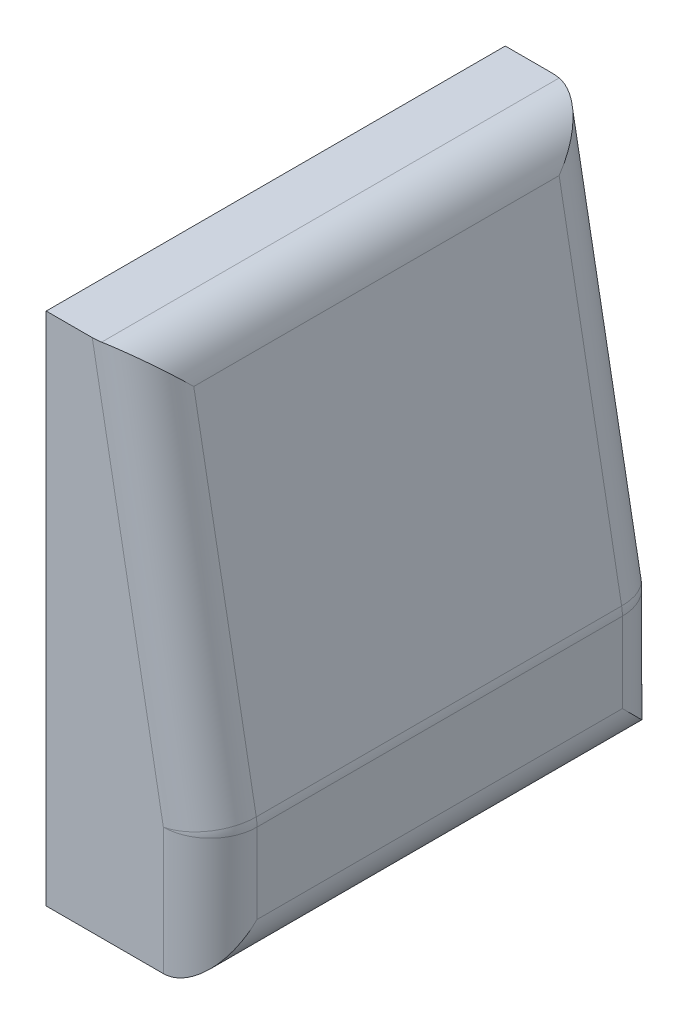
ISO-10303-21;
HEADER;
FILE_DESCRIPTION(('STEP AP214'),'2;1');
FILE_NAME('part.step','',(''),(''),'','','');
FILE_SCHEMA(('AUTOMOTIVE_DESIGN { 1 0 10303 214 1 1 1 1 }'));
ENDSEC;
DATA;
#1=APPLICATION_CONTEXT('core data for automotive mechanical design processes');
#2=APPLICATION_PROTOCOL_DEFINITION('international standard','automotive_design',2000,#1);
#3=PRODUCT_CONTEXT('',#1,'mechanical');
#4=PRODUCT('Part','Part','',(#3));
#5=PRODUCT_RELATED_PRODUCT_CATEGORY('part','',(#4));
#6=PRODUCT_DEFINITION_FORMATION('','',#4);
#7=PRODUCT_DEFINITION_CONTEXT('part definition',#1,'design');
#8=PRODUCT_DEFINITION('design','',#6,#7);
#9=PRODUCT_DEFINITION_SHAPE('','',#8);
#10=(LENGTH_UNIT() NAMED_UNIT(*) SI_UNIT(.MILLI.,.METRE.));
#11=(NAMED_UNIT(*) PLANE_ANGLE_UNIT() SI_UNIT($,.RADIAN.));
#12=(NAMED_UNIT(*) SI_UNIT($,.STERADIAN.) SOLID_ANGLE_UNIT());
#13=UNCERTAINTY_MEASURE_WITH_UNIT(LENGTH_MEASURE(1.E-05),#10,'distance_accuracy_value','');
#14=(GEOMETRIC_REPRESENTATION_CONTEXT(3) GLOBAL_UNCERTAINTY_ASSIGNED_CONTEXT((#13)) GLOBAL_UNIT_ASSIGNED_CONTEXT((#10,
#11,#12)) REPRESENTATION_CONTEXT('',''));
#15=CARTESIAN_POINT('',(0.,0.,0.));
#16=DIRECTION('',(0.,0.,1.));
#17=DIRECTION('',(1.,0.,0.));
#18=AXIS2_PLACEMENT_3D('',#15,#16,#17);
#19=CARTESIAN_POINT('',(200.,550.,490.));
#20=DIRECTION('',(0.,-1.,0.));
#21=DIRECTION('',(1.,0.,0.));
#22=AXIS2_PLACEMENT_3D('',#19,#20,#21);
#23=PLANE('',#22);
#24=DIRECTION('',(-1.,0.,0.));
#25=VECTOR('',#24,1.);
#26=CARTESIAN_POINT('',(200.,550.,490.));
#27=LINE('',#26,#25);
#28=CARTESIAN_POINT('',(98.3406558713782,550.,490.));
#29=VERTEX_POINT('',#28);
#30=CARTESIAN_POINT('',(-2.05721908245201E-13,550.,490.));
#31=VERTEX_POINT('',#30);
#32=EDGE_CURVE('E120',#29,#31,#27,.T.);
#33=ORIENTED_EDGE('',*,*,#32,.F.);
#34=CARTESIAN_POINT('',(98.3406558713782,550.,390.));
#35=DIRECTION('',(0.,-1.,0.));
#36=DIRECTION('',(1.,0.,0.));
#37=AXIS2_PLACEMENT_3D('',#34,#35,#36);
#38=ELLIPSE('',#37,101.659344128622,100.);
#39=CARTESIAN_POINT('',(116.633338798207,550.,488.367740670723));
#40=VERTEX_POINT('',#39);
#41=EDGE_CURVE('E155',#29,#40,#38,.F.);
#42=ORIENTED_EDGE('',*,*,#41,.T.);
#43=DIRECTION('',(0.,0.,-1.));
#44=VECTOR('',#43,1.);
#45=CARTESIAN_POINT('',(116.633338798207,550.,490.));
#46=LINE('',#45,#44);
#47=CARTESIAN_POINT('',(116.633338798207,550.,-488.367740670723));
#48=VERTEX_POINT('',#47);
#49=EDGE_CURVE('E153',#40,#48,#46,.T.);
#50=ORIENTED_EDGE('',*,*,#49,.T.);
#51=CARTESIAN_POINT('',(98.3406558713782,550.,-390.));
#52=DIRECTION('',(0.,-1.,0.));
#53=DIRECTION('',(-1.,0.,0.));
#54=AXIS2_PLACEMENT_3D('',#51,#52,#53);
#55=ELLIPSE('',#54,101.659344128622,100.);
#56=CARTESIAN_POINT('',(98.3406558713782,550.,-490.));
#57=VERTEX_POINT('',#56);
#58=EDGE_CURVE('E151',#48,#57,#55,.F.);
#59=ORIENTED_EDGE('',*,*,#58,.T.);
#60=DIRECTION('',(-1.,0.,0.));
#61=VECTOR('',#60,1.);
#62=CARTESIAN_POINT('',(200.,550.,-490.));
#63=LINE('',#62,#61);
#64=CARTESIAN_POINT('',(-2.05721908245201E-13,550.,-490.));
#65=VERTEX_POINT('',#64);
#66=EDGE_CURVE('E142',#57,#65,#63,.T.);
#67=ORIENTED_EDGE('',*,*,#66,.T.);
#68=DIRECTION('',(0.,0.,-1.));
#69=VECTOR('',#68,1.);
#70=CARTESIAN_POINT('',(-2.05721908245201E-13,550.,490.));
#71=LINE('',#70,#69);
#72=EDGE_CURVE('E135',#31,#65,#71,.T.);
#73=ORIENTED_EDGE('',*,*,#72,.F.);
#74=EDGE_LOOP('',(#33,#42,#50,#59,#67,#73));
#75=FACE_BOUND('',#74,.T.);
#76=ADVANCED_FACE('F43',(#75),#23,.F.);
#77=CARTESIAN_POINT('',(-2.05721908245201E-13,550.,490.));
#78=DIRECTION('',(1.,0.,0.));
#79=DIRECTION('',(0.,1.,0.));
#80=AXIS2_PLACEMENT_3D('',#77,#78,#79);
#81=PLANE('',#80);
#82=DIRECTION('',(0.,-1.,0.));
#83=VECTOR('',#82,1.);
#84=CARTESIAN_POINT('',(-2.05721908245201E-13,550.,-490.));
#85=LINE('',#84,#83);
#86=CARTESIAN_POINT('',(1.31055961520322E-13,-550.,-490.));
#87=VERTEX_POINT('',#86);
#88=EDGE_CURVE('E207',#65,#87,#85,.T.);
#89=ORIENTED_EDGE('',*,*,#88,.T.);
#90=DIRECTION('',(0.,0.,-1.));
#91=VECTOR('',#90,1.);
#92=CARTESIAN_POINT('',(1.31055961520322E-13,-550.,490.));
#93=LINE('',#92,#91);
#94=CARTESIAN_POINT('',(1.31055961520322E-13,-550.,490.));
#95=VERTEX_POINT('',#94);
#96=EDGE_CURVE('E137',#95,#87,#93,.T.);
#97=ORIENTED_EDGE('',*,*,#96,.F.);
#98=DIRECTION('',(0.,-1.,0.));
#99=VECTOR('',#98,1.);
#100=CARTESIAN_POINT('',(-2.05721908245201E-13,550.,490.));
#101=LINE('',#100,#99);
#102=EDGE_CURVE('E124',#31,#95,#101,.T.);
#103=ORIENTED_EDGE('',*,*,#102,.F.);
#104=ORIENTED_EDGE('',*,*,#72,.T.);
#105=EDGE_LOOP('',(#89,#97,#103,#104));
#106=FACE_BOUND('',#105,.T.);
#107=ADVANCED_FACE('F134',(#106),#81,.F.);
#108=CARTESIAN_POINT('',(1.31055961520322E-13,-550.,490.));
#109=DIRECTION('',(0.,1.,0.));
#110=DIRECTION('',(0.,0.,1.));
#111=AXIS2_PLACEMENT_3D('',#108,#109,#110);
#112=PLANE('',#111);
#113=DIRECTION('',(1.,0.,0.));
#114=VECTOR('',#113,1.);
#115=CARTESIAN_POINT('',(1.31055961520322E-13,-550.,-490.));
#116=LINE('',#115,#114);
#117=CARTESIAN_POINT('',(250.,-550.,-490.));
#118=VERTEX_POINT('',#117);
#119=EDGE_CURVE('E130',#87,#118,#116,.T.);
#120=ORIENTED_EDGE('',*,*,#119,.T.);
#121=DIRECTION('',(0.,0.,-1.));
#122=VECTOR('',#121,1.);
#123=CARTESIAN_POINT('',(250.,-550.,490.));
#124=LINE('',#123,#122);
#125=CARTESIAN_POINT('',(250.,-550.,490.));
#126=VERTEX_POINT('',#125);
#127=EDGE_CURVE('E11',#118,#126,#124,.F.);
#128=ORIENTED_EDGE('',*,*,#127,.T.);
#129=DIRECTION('',(1.,0.,0.));
#130=VECTOR('',#129,1.);
#131=CARTESIAN_POINT('',(1.31055961520322E-13,-550.,490.));
#132=LINE('',#131,#130);
#133=EDGE_CURVE('E139',#95,#126,#132,.T.);
#134=ORIENTED_EDGE('',*,*,#133,.F.);
#135=ORIENTED_EDGE('',*,*,#96,.T.);
#136=EDGE_LOOP('',(#120,#128,#134,#135));
#137=FACE_BOUND('',#136,.T.);
#138=ADVANCED_FACE('F214',(#137),#112,.F.);
#139=CARTESIAN_POINT('',(350.,-550.,490.));
#140=DIRECTION('',(-1.,0.,0.));
#141=DIRECTION('',(0.,0.,1.));
#142=AXIS2_PLACEMENT_3D('',#139,#140,#141);
#143=PLANE('',#142);
#144=DIRECTION('',(0.,1.,0.));
#145=VECTOR('',#144,1.);
#146=CARTESIAN_POINT('',(350.,-550.,390.));
#147=LINE('',#146,#145);
#148=CARTESIAN_POINT('',(350.,-279.071081236465,390.));
#149=VERTEX_POINT('',#148);
#150=CARTESIAN_POINT('',(350.,-450.,390.));
#151=VERTEX_POINT('',#150);
#152=EDGE_CURVE('E60',#149,#151,#147,.F.);
#153=ORIENTED_EDGE('',*,*,#152,.T.);
#154=DIRECTION('',(0.,0.,-1.));
#155=VECTOR('',#154,1.);
#156=CARTESIAN_POINT('',(350.,-450.,490.));
#157=LINE('',#156,#155);
#158=CARTESIAN_POINT('',(350.,-450.,-390.));
#159=VERTEX_POINT('',#158);
#160=EDGE_CURVE('E52',#151,#159,#157,.T.);
#161=ORIENTED_EDGE('',*,*,#160,.T.);
#162=DIRECTION('',(0.,1.,0.));
#163=VECTOR('',#162,1.);
#164=CARTESIAN_POINT('',(350.,-550.,-390.));
#165=LINE('',#164,#163);
#166=CARTESIAN_POINT('',(350.,-279.071081236465,-390.));
#167=VERTEX_POINT('',#166);
#168=EDGE_CURVE('E170',#159,#167,#165,.T.);
#169=ORIENTED_EDGE('',*,*,#168,.T.);
#170=DIRECTION('',(0.,0.,-1.));
#171=VECTOR('',#170,1.);
#172=CARTESIAN_POINT('',(350.,-279.071081236465,490.));
#173=LINE('',#172,#171);
#174=EDGE_CURVE('E65',#167,#149,#173,.F.);
#175=ORIENTED_EDGE('',*,*,#174,.T.);
#176=EDGE_LOOP('',(#153,#161,#169,#175));
#177=FACE_BOUND('',#176,.T.);
#178=ADVANCED_FACE('F380',(#177),#143,.F.);
#179=CARTESIAN_POINT('',(350.,-270.,490.));
#180=DIRECTION('',(-0.983677406707226,-0.17994098903181,0.));
#181=DIRECTION('',(0.17994098903181,-0.983677406707226,0.));
#182=AXIS2_PLACEMENT_3D('',#179,#180,#181);
#183=PLANE('',#182);
#184=DIRECTION('',(0.,0.,-1.));
#185=VECTOR('',#184,1.);
#186=CARTESIAN_POINT('',(215.00107946893,467.994098903181,490.));
#187=LINE('',#186,#185);
#188=CARTESIAN_POINT('',(215.00107946893,467.994098903181,-390.));
#189=VERTEX_POINT('',#188);
#190=CARTESIAN_POINT('',(215.00107946893,467.994098903181,390.));
#191=VERTEX_POINT('',#190);
#192=EDGE_CURVE('E161',#189,#191,#187,.F.);
#193=ORIENTED_EDGE('',*,*,#192,.T.);
#194=DIRECTION('',(-0.17994098903181,0.983677406707226,0.));
#195=VECTOR('',#194,1.);
#196=CARTESIAN_POINT('',(350.,-270.,390.));
#197=LINE('',#196,#195);
#198=CARTESIAN_POINT('',(348.367740670723,-261.076982333284,390.));
#199=VERTEX_POINT('',#198);
#200=EDGE_CURVE('E163',#191,#199,#197,.F.);
#201=ORIENTED_EDGE('',*,*,#200,.T.);
#202=DIRECTION('',(0.,0.,-1.));
#203=VECTOR('',#202,1.);
#204=CARTESIAN_POINT('',(348.367740670723,-261.076982333284,490.));
#205=LINE('',#204,#203);
#206=CARTESIAN_POINT('',(348.367740670723,-261.076982333284,-390.));
#207=VERTEX_POINT('',#206);
#208=EDGE_CURVE('E157',#199,#207,#205,.T.);
#209=ORIENTED_EDGE('',*,*,#208,.T.);
#210=DIRECTION('',(-0.17994098903181,0.983677406707226,0.));
#211=VECTOR('',#210,1.);
#212=CARTESIAN_POINT('',(350.,-270.,-390.));
#213=LINE('',#212,#211);
#214=EDGE_CURVE('E159',#207,#189,#213,.T.);
#215=ORIENTED_EDGE('',*,*,#214,.T.);
#216=EDGE_LOOP('',(#193,#201,#209,#215));
#217=FACE_BOUND('',#216,.T.);
#218=ADVANCED_FACE('F250',(#217),#183,.F.);
#219=CARTESIAN_POINT('',(0.,0.,490.));
#220=DIRECTION('',(0.,0.,1.));
#221=DIRECTION('',(1.,0.,0.));
#222=AXIS2_PLACEMENT_3D('',#219,#220,#221);
#223=PLANE('',#222);
#224=DIRECTION('',(0.,1.,0.));
#225=VECTOR('',#224,1.);
#226=CARTESIAN_POINT('',(250.,-270.,490.));
#227=LINE('',#226,#225);
#228=CARTESIAN_POINT('',(250.,-279.071081236465,490.));
#229=VERTEX_POINT('',#228);
#230=EDGE_CURVE('E144',#126,#229,#227,.T.);
#231=ORIENTED_EDGE('',*,*,#230,.T.);
#232=DIRECTION('',(-0.17994098903181,0.983677406707226,0.));
#233=VECTOR('',#232,1.);
#234=CARTESIAN_POINT('',(101.632259329277,532.005901096819,490.));
#235=LINE('',#234,#233);
#236=EDGE_CURVE('E127',#229,#29,#235,.T.);
#237=ORIENTED_EDGE('',*,*,#236,.T.);
#238=ORIENTED_EDGE('',*,*,#32,.T.);
#239=ORIENTED_EDGE('',*,*,#102,.T.);
#240=ORIENTED_EDGE('',*,*,#133,.T.);
#241=EDGE_LOOP('',(#231,#237,#238,#239,#240));
#242=FACE_BOUND('',#241,.T.);
#243=ADVANCED_FACE('F122',(#242),#223,.T.);
#244=CARTESIAN_POINT('',(0.,0.,-490.));
#245=DIRECTION('',(0.,0.,1.));
#246=DIRECTION('',(1.,0.,0.));
#247=AXIS2_PLACEMENT_3D('',#244,#245,#246);
#248=PLANE('',#247);
#249=ORIENTED_EDGE('',*,*,#66,.F.);
#250=DIRECTION('',(-0.17994098903181,0.983677406707226,0.));
#251=VECTOR('',#250,1.);
#252=CARTESIAN_POINT('',(192.508644420657,35.2149959306081,-490.));
#253=LINE('',#252,#251);
#254=CARTESIAN_POINT('',(250.,-279.071081236465,-490.));
#255=VERTEX_POINT('',#254);
#256=EDGE_CURVE('E168',#57,#255,#253,.F.);
#257=ORIENTED_EDGE('',*,*,#256,.T.);
#258=DIRECTION('',(0.,1.,0.));
#259=VECTOR('',#258,1.);
#260=CARTESIAN_POINT('',(250.,0.,-490.));
#261=LINE('',#260,#259);
#262=EDGE_CURVE('E166',#255,#118,#261,.F.);
#263=ORIENTED_EDGE('',*,*,#262,.T.);
#264=ORIENTED_EDGE('',*,*,#119,.F.);
#265=ORIENTED_EDGE('',*,*,#88,.F.);
#266=EDGE_LOOP('',(#249,#257,#263,#264,#265));
#267=FACE_BOUND('',#266,.T.);
#268=ADVANCED_FACE('F243',(#267),#248,.F.);
#269=CARTESIAN_POINT('',(250.,-550.,-390.));
#270=DIRECTION('',(0.,1.,0.));
#271=DIRECTION('',(0.,0.,1.));
#272=AXIS2_PLACEMENT_3D('',#269,#270,#271);
#273=CYLINDRICAL_SURFACE('',#272,100.);
#274=CARTESIAN_POINT('',(250.,-279.071081236465,-390.));
#275=DIRECTION('',(0.,1.,0.));
#276=DIRECTION('',(0.,0.,1.));
#277=AXIS2_PLACEMENT_3D('',#274,#275,#276);
#278=CIRCLE('',#277,100.);
#279=EDGE_CURVE('E197',#167,#255,#278,.T.);
#280=ORIENTED_EDGE('',*,*,#279,.F.);
#281=ORIENTED_EDGE('',*,*,#168,.F.);
#282=CARTESIAN_POINT('',(250.,-450.,-390.));
#283=DIRECTION('',(0.,0.707106781186547,-0.707106781186547));
#284=DIRECTION('',(0.,0.707106781186547,0.707106781186547));
#285=AXIS2_PLACEMENT_3D('',#282,#283,#284);
#286=ELLIPSE('',#285,141.42135623731,100.);
#287=EDGE_CURVE('E47',#118,#159,#286,.F.);
#288=ORIENTED_EDGE('',*,*,#287,.F.);
#289=ORIENTED_EDGE('',*,*,#262,.F.);
#290=EDGE_LOOP('',(#280,#281,#288,#289));
#291=FACE_BOUND('',#290,.T.);
#292=ADVANCED_FACE('F45',(#291),#273,.T.);
#293=CARTESIAN_POINT('',(250.,-450.,490.));
#294=DIRECTION('',(0.,0.,-1.));
#295=DIRECTION('',(-1.,0.,0.));
#296=AXIS2_PLACEMENT_3D('',#293,#294,#295);
#297=CYLINDRICAL_SURFACE('',#296,100.);
#298=ORIENTED_EDGE('',*,*,#287,.T.);
#299=ORIENTED_EDGE('',*,*,#160,.F.);
#300=CARTESIAN_POINT('',(250.,-450.,390.));
#301=DIRECTION('',(0.,-0.707106781186547,-0.707106781186547));
#302=DIRECTION('',(0.,-0.707106781186547,0.707106781186547));
#303=AXIS2_PLACEMENT_3D('',#300,#301,#302);
#304=ELLIPSE('',#303,141.42135623731,100.);
#305=EDGE_CURVE('E192',#126,#151,#304,.F.);
#306=ORIENTED_EDGE('',*,*,#305,.F.);
#307=ORIENTED_EDGE('',*,*,#127,.F.);
#308=EDGE_LOOP('',(#298,#299,#306,#307));
#309=FACE_BOUND('',#308,.T.);
#310=ADVANCED_FACE('F219',(#309),#297,.T.);
#311=CARTESIAN_POINT('',(250.,-279.071081236465,-390.));
#312=DIRECTION('',(0.,0.,-1.));
#313=DIRECTION('',(-1.,0.,0.));
#314=AXIS2_PLACEMENT_3D('',#311,#312,#313);
#315=SPHERICAL_SURFACE('',#314,100.);
#316=CARTESIAN_POINT('',(250.,-279.071081236465,-390.));
#317=DIRECTION('',(0.17994098903181,-0.983677406707226,0.));
#318=DIRECTION('',(0.983677406707227,0.17994098903181,0.));
#319=AXIS2_PLACEMENT_3D('',#316,#317,#318);
#320=CIRCLE('',#319,100.);
#321=EDGE_CURVE('E189',#207,#255,#320,.F.);
#322=ORIENTED_EDGE('',*,*,#321,.F.);
#323=CARTESIAN_POINT('',(250.,-279.071081236465,-390.));
#324=DIRECTION('',(0.,0.,-1.));
#325=DIRECTION('',(-1.,0.,0.));
#326=AXIS2_PLACEMENT_3D('',#323,#324,#325);
#327=CIRCLE('',#326,100.);
#328=EDGE_CURVE('E195',#167,#207,#327,.F.);
#329=ORIENTED_EDGE('',*,*,#328,.F.);
#330=ORIENTED_EDGE('',*,*,#279,.T.);
#331=EDGE_LOOP('',(#322,#329,#330));
#332=FACE_BOUND('',#331,.T.);
#333=ADVANCED_FACE('F274',(#332),#315,.T.);
#334=CARTESIAN_POINT('',(250.,-279.071081236465,490.));
#335=DIRECTION('',(0.,0.,-1.));
#336=DIRECTION('',(-1.,0.,0.));
#337=AXIS2_PLACEMENT_3D('',#334,#335,#336);
#338=CYLINDRICAL_SURFACE('',#337,100.);
#339=ORIENTED_EDGE('',*,*,#328,.T.);
#340=ORIENTED_EDGE('',*,*,#208,.F.);
#341=CARTESIAN_POINT('',(250.,-279.071081236465,390.));
#342=DIRECTION('',(0.,0.,1.));
#343=DIRECTION('',(1.,0.,0.));
#344=AXIS2_PLACEMENT_3D('',#341,#342,#343);
#345=CIRCLE('',#344,100.);
#346=EDGE_CURVE('E186',#149,#199,#345,.T.);
#347=ORIENTED_EDGE('',*,*,#346,.F.);
#348=ORIENTED_EDGE('',*,*,#174,.F.);
#349=EDGE_LOOP('',(#339,#340,#347,#348));
#350=FACE_BOUND('',#349,.T.);
#351=ADVANCED_FACE('F271',(#350),#338,.T.);
#352=CARTESIAN_POINT('',(250.,0.,390.));
#353=DIRECTION('',(0.,-1.,0.));
#354=DIRECTION('',(0.,0.,-1.));
#355=AXIS2_PLACEMENT_3D('',#352,#353,#354);
#356=CYLINDRICAL_SURFACE('',#355,100.);
#357=ORIENTED_EDGE('',*,*,#305,.T.);
#358=ORIENTED_EDGE('',*,*,#152,.F.);
#359=CARTESIAN_POINT('',(250.,-279.071081236465,390.));
#360=DIRECTION('',(0.,1.,0.));
#361=DIRECTION('',(-1.,0.,0.));
#362=AXIS2_PLACEMENT_3D('',#359,#360,#361);
#363=CIRCLE('',#362,100.);
#364=EDGE_CURVE('E183',#229,#149,#363,.T.);
#365=ORIENTED_EDGE('',*,*,#364,.F.);
#366=ORIENTED_EDGE('',*,*,#230,.F.);
#367=EDGE_LOOP('',(#357,#358,#365,#366));
#368=FACE_BOUND('',#367,.T.);
#369=ADVANCED_FACE('F223',(#368),#356,.T.);
#370=CARTESIAN_POINT('',(251.632259329277,-287.994098903181,-390.));
#371=DIRECTION('',(-0.17994098903181,0.983677406707226,0.));
#372=DIRECTION('',(-0.983677406707226,-0.17994098903181,0.));
#373=AXIS2_PLACEMENT_3D('',#370,#371,#372);
#374=CYLINDRICAL_SURFACE('',#373,100.);
#375=ORIENTED_EDGE('',*,*,#256,.F.);
#376=ORIENTED_EDGE('',*,*,#58,.F.);
#377=CARTESIAN_POINT('',(116.633338798208,450.,-390.));
#378=DIRECTION('',(-0.127237493557807,0.695564964782677,0.707106781186547));
#379=DIRECTION('',(-0.127237493557807,0.695564964782677,-0.707106781186547));
#380=AXIS2_PLACEMENT_3D('',#377,#378,#379);
#381=ELLIPSE('',#380,141.42135623731,100.);
#382=EDGE_CURVE('E180',#189,#48,#381,.T.);
#383=ORIENTED_EDGE('',*,*,#382,.F.);
#384=ORIENTED_EDGE('',*,*,#214,.F.);
#385=ORIENTED_EDGE('',*,*,#321,.T.);
#386=EDGE_LOOP('',(#375,#376,#383,#384,#385));
#387=FACE_BOUND('',#386,.T.);
#388=ADVANCED_FACE('F242',(#387),#374,.T.);
#389=CARTESIAN_POINT('',(250.,-279.071081236465,390.));
#390=DIRECTION('',(0.,0.,1.));
#391=DIRECTION('',(0.,-1.,0.));
#392=AXIS2_PLACEMENT_3D('',#389,#390,#391);
#393=SPHERICAL_SURFACE('',#392,100.);
#394=ORIENTED_EDGE('',*,*,#364,.T.);
#395=ORIENTED_EDGE('',*,*,#346,.T.);
#396=CARTESIAN_POINT('',(250.,-279.071081236465,390.));
#397=DIRECTION('',(0.17994098903181,-0.983677406707226,0.));
#398=DIRECTION('',(0.983677406707227,0.17994098903181,0.));
#399=AXIS2_PLACEMENT_3D('',#396,#397,#398);
#400=CIRCLE('',#399,100.);
#401=EDGE_CURVE('E178',#229,#199,#400,.F.);
#402=ORIENTED_EDGE('',*,*,#401,.F.);
#403=EDGE_LOOP('',(#394,#395,#402));
#404=FACE_BOUND('',#403,.T.);
#405=ADVANCED_FACE('F227',(#404),#393,.T.);
#406=CARTESIAN_POINT('',(116.633338798208,450.,490.));
#407=DIRECTION('',(0.,0.,-1.));
#408=DIRECTION('',(-1.,0.,0.));
#409=AXIS2_PLACEMENT_3D('',#406,#407,#408);
#410=CYLINDRICAL_SURFACE('',#409,100.);
#411=ORIENTED_EDGE('',*,*,#382,.T.);
#412=ORIENTED_EDGE('',*,*,#49,.F.);
#413=CARTESIAN_POINT('',(116.633338798208,450.,390.));
#414=DIRECTION('',(-0.127237493557807,0.695564964782677,-0.707106781186547));
#415=DIRECTION('',(0.127237493557807,-0.695564964782677,-0.707106781186547));
#416=AXIS2_PLACEMENT_3D('',#413,#414,#415);
#417=ELLIPSE('',#416,141.42135623731,100.);
#418=EDGE_CURVE('E175',#191,#40,#417,.F.);
#419=ORIENTED_EDGE('',*,*,#418,.F.);
#420=ORIENTED_EDGE('',*,*,#192,.F.);
#421=EDGE_LOOP('',(#411,#412,#419,#420));
#422=FACE_BOUND('',#421,.T.);
#423=ADVANCED_FACE('F236',(#422),#410,.T.);
#424=CARTESIAN_POINT('',(192.508644420657,35.2149959306081,390.));
#425=DIRECTION('',(0.17994098903181,-0.983677406707226,0.));
#426=DIRECTION('',(0.983677406707226,0.17994098903181,0.));
#427=AXIS2_PLACEMENT_3D('',#424,#425,#426);
#428=CYLINDRICAL_SURFACE('',#427,100.);
#429=ORIENTED_EDGE('',*,*,#401,.T.);
#430=ORIENTED_EDGE('',*,*,#200,.F.);
#431=ORIENTED_EDGE('',*,*,#418,.T.);
#432=ORIENTED_EDGE('',*,*,#41,.F.);
#433=ORIENTED_EDGE('',*,*,#236,.F.);
#434=EDGE_LOOP('',(#429,#430,#431,#432,#433));
#435=FACE_BOUND('',#434,.T.);
#436=ADVANCED_FACE('F231',(#435),#428,.T.);
#437=CLOSED_SHELL('',(#76,#107,#138,#178,#218,#243,#268,#292,#310,#333,#351,#369,#388,#405,#423,#436));
#438=MANIFOLD_SOLID_BREP('B2',#437);
#439=ADVANCED_BREP_SHAPE_REPRESENTATION('',(#18,#438),#14);
#440=SHAPE_DEFINITION_REPRESENTATION(#9,#439);
ENDSEC;
END-ISO-10303-21;
